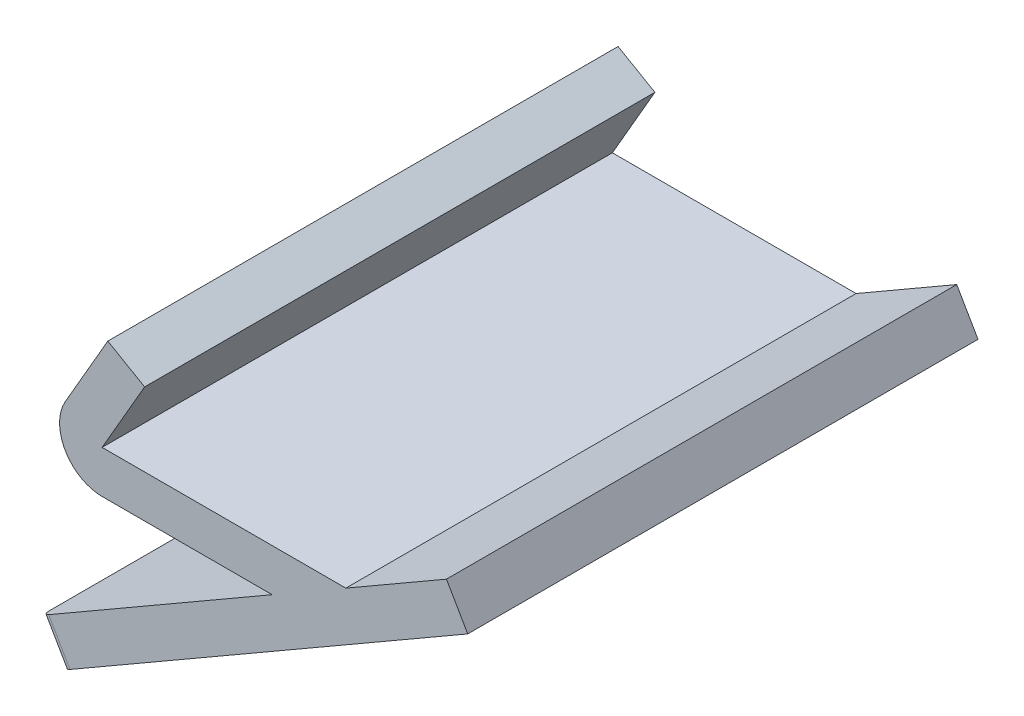
ISO-10303-21;
HEADER;
FILE_DESCRIPTION(('STEP AP214'),'2;1');
FILE_NAME('part.step','',(''),(''),'','','');
FILE_SCHEMA(('AUTOMOTIVE_DESIGN { 1 0 10303 214 1 1 1 1 }'));
ENDSEC;
DATA;
#1=APPLICATION_CONTEXT('core data for automotive mechanical design processes');
#2=APPLICATION_PROTOCOL_DEFINITION('international standard','automotive_design',2000,#1);
#3=PRODUCT_CONTEXT('',#1,'mechanical');
#4=PRODUCT('Part','Part','',(#3));
#5=PRODUCT_RELATED_PRODUCT_CATEGORY('part','',(#4));
#6=PRODUCT_DEFINITION_FORMATION('','',#4);
#7=PRODUCT_DEFINITION_CONTEXT('part definition',#1,'design');
#8=PRODUCT_DEFINITION('design','',#6,#7);
#9=PRODUCT_DEFINITION_SHAPE('','',#8);
#10=(LENGTH_UNIT() NAMED_UNIT(*) SI_UNIT(.MILLI.,.METRE.));
#11=(NAMED_UNIT(*) PLANE_ANGLE_UNIT() SI_UNIT($,.RADIAN.));
#12=(NAMED_UNIT(*) SI_UNIT($,.STERADIAN.) SOLID_ANGLE_UNIT());
#13=UNCERTAINTY_MEASURE_WITH_UNIT(LENGTH_MEASURE(1.E-05),#10,'distance_accuracy_value','');
#14=(GEOMETRIC_REPRESENTATION_CONTEXT(3) GLOBAL_UNCERTAINTY_ASSIGNED_CONTEXT((#13)) GLOBAL_UNIT_ASSIGNED_CONTEXT((#10,
#11,#12)) REPRESENTATION_CONTEXT('',''));
#15=CARTESIAN_POINT('',(0.,0.,0.));
#16=DIRECTION('',(0.,0.,1.));
#17=DIRECTION('',(1.,0.,0.));
#18=AXIS2_PLACEMENT_3D('',#15,#16,#17);
#19=CARTESIAN_POINT('',(0.,0.,60.));
#20=DIRECTION('',(0.,0.,1.));
#21=DIRECTION('',(1.,0.,0.));
#22=AXIS2_PLACEMENT_3D('',#19,#20,#21);
#23=PLANE('',#22);
#24=DIRECTION('',(-0.866025403784442,-0.499999999999995,0.));
#25=VECTOR('',#24,1.);
#26=CARTESIAN_POINT('',(8.25471698113209,10.6272579891649,60.));
#27=LINE('',#26,#25);
#28=CARTESIAN_POINT('',(0.754716981131959,6.29713097024269,60.));
#29=VERTEX_POINT('',#28);
#30=CARTESIAN_POINT('',(-25.5202737664612,-8.87274201083493,60.));
#31=VERTEX_POINT('',#30);
#32=EDGE_CURVE('E245',#29,#31,#27,.T.);
#33=ORIENTED_EDGE('',*,*,#32,.T.);
#34=DIRECTION('',(-0.499999999999995,0.866025403784442,0.));
#35=VECTOR('',#34,1.);
#36=CARTESIAN_POINT('',(4.47972623353853,-60.8342662379014,60.));
#37=LINE('',#36,#35);
#38=CARTESIAN_POINT('',(-23.0202737664612,-13.2028690297572,60.));
#39=VERTEX_POINT('',#38);
#40=EDGE_CURVE('E50',#39,#31,#37,.T.);
#41=ORIENTED_EDGE('',*,*,#40,.F.);
#42=DIRECTION('',(0.866025403784441,0.499999999999995,0.));
#43=VECTOR('',#42,1.);
#44=CARTESIAN_POINT('',(10.7547169811321,6.29713097024269,60.));
#45=LINE('',#44,#43);
#46=CARTESIAN_POINT('',(23.7450980378987,13.7971309702426,60.));
#47=VERTEX_POINT('',#46);
#48=EDGE_CURVE('E238',#39,#47,#45,.T.);
#49=ORIENTED_EDGE('',*,*,#48,.T.);
#50=DIRECTION('',(-0.499999999999995,0.866025403784442,0.));
#51=VECTOR('',#50,1.);
#52=CARTESIAN_POINT('',(23.7450980378987,13.7971309702426,60.));
#53=LINE('',#52,#51);
#54=CARTESIAN_POINT('',(21.2450980378987,18.1272579891648,60.));
#55=VERTEX_POINT('',#54);
#56=EDGE_CURVE('E210',#47,#55,#53,.T.);
#57=ORIENTED_EDGE('',*,*,#56,.T.);
#58=CARTESIAN_POINT('',(9.41497101897644,11.2971309702427,60.));
#59=VERTEX_POINT('',#58);
#60=EDGE_CURVE('E246',#55,#59,#27,.T.);
#61=ORIENTED_EDGE('',*,*,#60,.T.);
#62=DIRECTION('',(-1.,0.,0.));
#63=VECTOR('',#62,1.);
#64=CARTESIAN_POINT('',(-19.2452830188679,11.2971309702427,60.));
#65=LINE('',#64,#63);
#66=CARTESIAN_POINT('',(-19.2452830188679,11.2971309702427,60.));
#67=VERTEX_POINT('',#66);
#68=EDGE_CURVE('E198',#59,#67,#65,.T.);
#69=ORIENTED_EDGE('',*,*,#68,.T.);
#70=DIRECTION('',(0.500000000000004,0.866025403784436,0.));
#71=VECTOR('',#70,1.);
#72=CARTESIAN_POINT('',(-19.2452830188679,11.2971309702427,60.));
#73=LINE('',#72,#71);
#74=CARTESIAN_POINT('',(-14.2452830188678,19.9573850080872,60.));
#75=VERTEX_POINT('',#74);
#76=EDGE_CURVE('E165',#67,#75,#73,.T.);
#77=ORIENTED_EDGE('',*,*,#76,.T.);
#78=DIRECTION('',(-0.866025403784446,0.499999999999988,0.));
#79=VECTOR('',#78,1.);
#80=CARTESIAN_POINT('',(-14.2452830188678,19.9573850080872,60.));
#81=LINE('',#80,#79);
#82=CARTESIAN_POINT('',(-18.5754100377901,22.4573850080871,60.));
#83=VERTEX_POINT('',#82);
#84=EDGE_CURVE('E178',#75,#83,#81,.T.);
#85=ORIENTED_EDGE('',*,*,#84,.T.);
#86=DIRECTION('',(-0.500000000000004,-0.866025403784436,0.));
#87=VECTOR('',#86,1.);
#88=CARTESIAN_POINT('',(-23.5754100377901,13.7971309702428,60.));
#89=LINE('',#88,#87);
#90=CARTESIAN_POINT('',(-23.5754100377901,13.7971309702428,60.));
#91=VERTEX_POINT('',#90);
#92=EDGE_CURVE('E170',#83,#91,#89,.T.);
#93=ORIENTED_EDGE('',*,*,#92,.T.);
#94=CARTESIAN_POINT('',(-19.2452830188679,11.2971309702427,60.));
#95=DIRECTION('',(0.,0.,1.));
#96=DIRECTION('',(-1.,0.,0.));
#97=AXIS2_PLACEMENT_3D('',#94,#95,#96);
#98=CIRCLE('',#97,5.);
#99=CARTESIAN_POINT('',(-19.2452830188679,6.29713097024269,60.));
#100=VERTEX_POINT('',#99);
#101=EDGE_CURVE('E184',#91,#100,#98,.T.);
#102=ORIENTED_EDGE('',*,*,#101,.T.);
#103=DIRECTION('',(1.,0.,0.));
#104=VECTOR('',#103,1.);
#105=CARTESIAN_POINT('',(-19.2452830188679,6.29713097024269,60.));
#106=LINE('',#105,#104);
#107=EDGE_CURVE('E195',#100,#29,#106,.T.);
#108=ORIENTED_EDGE('',*,*,#107,.T.);
#109=EDGE_LOOP('',(#33,#41,#49,#57,#61,#69,#77,#85,#93,#102,#108));
#110=FACE_BOUND('',#109,.T.);
#111=ADVANCED_FACE('F35',(#110),#23,.T.);
#112=CARTESIAN_POINT('',(0.,0.,0.));
#113=DIRECTION('',(0.,0.,1.));
#114=DIRECTION('',(1.,0.,0.));
#115=AXIS2_PLACEMENT_3D('',#112,#113,#114);
#116=PLANE('',#115);
#117=DIRECTION('',(-0.499999999999995,0.866025403784442,0.));
#118=VECTOR('',#117,1.);
#119=CARTESIAN_POINT('',(4.47972623353853,-60.8342662379014,0.));
#120=LINE('',#119,#118);
#121=CARTESIAN_POINT('',(-23.0202737664612,-13.2028690297572,0.));
#122=VERTEX_POINT('',#121);
#123=CARTESIAN_POINT('',(-25.5202737664612,-8.87274201083493,0.));
#124=VERTEX_POINT('',#123);
#125=EDGE_CURVE('E290',#122,#124,#120,.T.);
#126=ORIENTED_EDGE('',*,*,#125,.T.);
#127=DIRECTION('',(-0.866025403784441,-0.499999999999995,0.));
#128=VECTOR('',#127,1.);
#129=CARTESIAN_POINT('',(21.2450980378987,18.1272579891648,0.));
#130=LINE('',#129,#128);
#131=CARTESIAN_POINT('',(0.754716981131963,6.29713097024269,0.));
#132=VERTEX_POINT('',#131);
#133=EDGE_CURVE('E241',#132,#124,#130,.T.);
#134=ORIENTED_EDGE('',*,*,#133,.F.);
#135=DIRECTION('',(1.,0.,0.));
#136=VECTOR('',#135,1.);
#137=CARTESIAN_POINT('',(-19.2452830188679,6.29713097024269,0.));
#138=LINE('',#137,#136);
#139=CARTESIAN_POINT('',(-19.2452830188679,6.29713097024269,0.));
#140=VERTEX_POINT('',#139);
#141=EDGE_CURVE('E194',#140,#132,#138,.T.);
#142=ORIENTED_EDGE('',*,*,#141,.F.);
#143=CARTESIAN_POINT('',(-19.2452830188679,11.2971309702427,0.));
#144=DIRECTION('',(0.,0.,1.));
#145=DIRECTION('',(-1.,0.,0.));
#146=AXIS2_PLACEMENT_3D('',#143,#144,#145);
#147=CIRCLE('',#146,5.);
#148=CARTESIAN_POINT('',(-23.5754100377901,13.7971309702428,0.));
#149=VERTEX_POINT('',#148);
#150=EDGE_CURVE('E186',#149,#140,#147,.T.);
#151=ORIENTED_EDGE('',*,*,#150,.F.);
#152=DIRECTION('',(-0.500000000000004,-0.866025403784436,0.));
#153=VECTOR('',#152,1.);
#154=CARTESIAN_POINT('',(-23.5754100377901,13.7971309702428,0.));
#155=LINE('',#154,#153);
#156=CARTESIAN_POINT('',(-18.5754100377901,22.4573850080871,0.));
#157=VERTEX_POINT('',#156);
#158=EDGE_CURVE('E173',#157,#149,#155,.T.);
#159=ORIENTED_EDGE('',*,*,#158,.F.);
#160=DIRECTION('',(-0.866025403784446,0.499999999999988,0.));
#161=VECTOR('',#160,1.);
#162=CARTESIAN_POINT('',(-14.2452830188678,19.9573850080872,0.));
#163=LINE('',#162,#161);
#164=CARTESIAN_POINT('',(-14.2452830188678,19.9573850080872,0.));
#165=VERTEX_POINT('',#164);
#166=EDGE_CURVE('E169',#165,#157,#163,.T.);
#167=ORIENTED_EDGE('',*,*,#166,.F.);
#168=DIRECTION('',(0.500000000000004,0.866025403784436,0.));
#169=VECTOR('',#168,1.);
#170=CARTESIAN_POINT('',(-19.2452830188679,11.2971309702427,0.));
#171=LINE('',#170,#169);
#172=CARTESIAN_POINT('',(-19.2452830188679,11.2971309702427,0.));
#173=VERTEX_POINT('',#172);
#174=EDGE_CURVE('E166',#173,#165,#171,.T.);
#175=ORIENTED_EDGE('',*,*,#174,.F.);
#176=DIRECTION('',(-1.,0.,0.));
#177=VECTOR('',#176,1.);
#178=CARTESIAN_POINT('',(-19.2452830188679,11.2971309702427,0.));
#179=LINE('',#178,#177);
#180=CARTESIAN_POINT('',(9.41497101897645,11.2971309702427,0.));
#181=VERTEX_POINT('',#180);
#182=EDGE_CURVE('E199',#181,#173,#179,.T.);
#183=ORIENTED_EDGE('',*,*,#182,.F.);
#184=CARTESIAN_POINT('',(21.2450980378987,18.1272579891648,0.));
#185=VERTEX_POINT('',#184);
#186=EDGE_CURVE('E159',#185,#181,#130,.T.);
#187=ORIENTED_EDGE('',*,*,#186,.F.);
#188=DIRECTION('',(-0.499999999999995,0.866025403784442,0.));
#189=VECTOR('',#188,1.);
#190=CARTESIAN_POINT('',(23.7450980378987,13.7971309702426,0.));
#191=LINE('',#190,#189);
#192=CARTESIAN_POINT('',(23.7450980378987,13.7971309702426,0.));
#193=VERTEX_POINT('',#192);
#194=EDGE_CURVE('E237',#193,#185,#191,.T.);
#195=ORIENTED_EDGE('',*,*,#194,.F.);
#196=DIRECTION('',(0.866025403784441,0.499999999999995,0.));
#197=VECTOR('',#196,1.);
#198=CARTESIAN_POINT('',(10.7547169811321,6.29713097024269,0.));
#199=LINE('',#198,#197);
#200=EDGE_CURVE('E235',#122,#193,#199,.T.);
#201=ORIENTED_EDGE('',*,*,#200,.F.);
#202=EDGE_LOOP('',(#126,#134,#142,#151,#159,#167,#175,#183,#187,#195,#201));
#203=FACE_BOUND('',#202,.T.);
#204=ADVANCED_FACE('F265',(#203),#116,.F.);
#205=CARTESIAN_POINT('',(-23.8862991702456,-13.7028690297571,0.));
#206=DIRECTION('',(-0.866025403784438,-0.500000000000002,0.));
#207=DIRECTION('',(0.500000000000002,-0.866025403784438,0.));
#208=AXIS2_PLACEMENT_3D('',#205,#206,#207);
#209=PLANE('',#208);
#210=DIRECTION('',(-0.499999999999995,0.866025403784442,0.));
#211=VECTOR('',#210,1.);
#212=CARTESIAN_POINT('',(3.61370082975409,-61.3342662379014,59.));
#213=LINE('',#212,#211);
#214=CARTESIAN_POINT('',(-23.8862991702456,-13.7028690297571,59.));
#215=VERTEX_POINT('',#214);
#216=CARTESIAN_POINT('',(-26.3862991702456,-9.37274201083492,59.));
#217=VERTEX_POINT('',#216);
#218=EDGE_CURVE('E129',#215,#217,#213,.T.);
#219=ORIENTED_EDGE('',*,*,#218,.T.);
#220=DIRECTION('',(0.,0.,1.));
#221=VECTOR('',#220,1.);
#222=CARTESIAN_POINT('',(-26.3862991702456,-9.37274201083492,0.));
#223=LINE('',#222,#221);
#224=CARTESIAN_POINT('',(-26.3862991702456,-9.37274201083492,1.));
#225=VERTEX_POINT('',#224);
#226=EDGE_CURVE('E139',#225,#217,#223,.T.);
#227=ORIENTED_EDGE('',*,*,#226,.F.);
#228=DIRECTION('',(-0.499999999999995,0.866025403784442,0.));
#229=VECTOR('',#228,1.);
#230=CARTESIAN_POINT('',(3.61370082975429,-61.3342662379013,1.));
#231=LINE('',#230,#229);
#232=CARTESIAN_POINT('',(-23.8862991702456,-13.7028690297571,1.));
#233=VERTEX_POINT('',#232);
#234=EDGE_CURVE('E11',#225,#233,#231,.F.);
#235=ORIENTED_EDGE('',*,*,#234,.T.);
#236=DIRECTION('',(0.,0.,1.));
#237=VECTOR('',#236,1.);
#238=CARTESIAN_POINT('',(-23.8862991702456,-13.7028690297571,0.));
#239=LINE('',#238,#237);
#240=EDGE_CURVE('E141',#233,#215,#239,.T.);
#241=ORIENTED_EDGE('',*,*,#240,.T.);
#242=EDGE_LOOP('',(#219,#227,#235,#241));
#243=FACE_BOUND('',#242,.T.);
#244=ADVANCED_FACE('F138',(#243),#209,.T.);
#245=CARTESIAN_POINT('',(-19.2452830188679,6.29713097024269,60.));
#246=DIRECTION('',(0.,1.,0.));
#247=DIRECTION('',(0.,0.,1.));
#248=AXIS2_PLACEMENT_3D('',#245,#246,#247);
#249=PLANE('',#248);
#250=ORIENTED_EDGE('',*,*,#141,.T.);
#251=DIRECTION('',(0.,0.,1.));
#252=VECTOR('',#251,1.);
#253=CARTESIAN_POINT('',(0.754716981131963,6.29713097024269,60.));
#254=LINE('',#253,#252);
#255=EDGE_CURVE('E162',#132,#29,#254,.T.);
#256=ORIENTED_EDGE('',*,*,#255,.T.);
#257=ORIENTED_EDGE('',*,*,#107,.F.);
#258=DIRECTION('',(0.,0.,-1.));
#259=VECTOR('',#258,1.);
#260=CARTESIAN_POINT('',(-19.2452830188679,6.29713097024269,60.));
#261=LINE('',#260,#259);
#262=EDGE_CURVE('E43',#100,#140,#261,.T.);
#263=ORIENTED_EDGE('',*,*,#262,.T.);
#264=EDGE_LOOP('',(#250,#256,#257,#263));
#265=FACE_BOUND('',#264,.T.);
#266=ADVANCED_FACE('F37',(#265),#249,.F.);
#267=CARTESIAN_POINT('',(-19.2452830188679,11.2971309702427,60.));
#268=DIRECTION('',(0.,-1.,0.));
#269=DIRECTION('',(0.,0.,-1.));
#270=AXIS2_PLACEMENT_3D('',#267,#268,#269);
#271=PLANE('',#270);
#272=ORIENTED_EDGE('',*,*,#68,.F.);
#273=DIRECTION('',(0.,0.,-1.));
#274=VECTOR('',#273,1.);
#275=CARTESIAN_POINT('',(9.41497101897646,11.2971309702427,60.));
#276=LINE('',#275,#274);
#277=EDGE_CURVE('E150',#59,#181,#276,.T.);
#278=ORIENTED_EDGE('',*,*,#277,.T.);
#279=ORIENTED_EDGE('',*,*,#182,.T.);
#280=DIRECTION('',(0.,0.,-1.));
#281=VECTOR('',#280,1.);
#282=CARTESIAN_POINT('',(-19.2452830188679,11.2971309702427,60.));
#283=LINE('',#282,#281);
#284=EDGE_CURVE('E201',#67,#173,#283,.T.);
#285=ORIENTED_EDGE('',*,*,#284,.F.);
#286=EDGE_LOOP('',(#272,#278,#279,#285));
#287=FACE_BOUND('',#286,.T.);
#288=ADVANCED_FACE('F271',(#287),#271,.F.);
#289=CARTESIAN_POINT('',(-19.2452830188679,11.2971309702427,0.));
#290=DIRECTION('',(0.,0.,1.));
#291=DIRECTION('',(1.,0.,0.));
#292=AXIS2_PLACEMENT_3D('',#289,#290,#291);
#293=CYLINDRICAL_SURFACE('',#292,5.);
#294=ORIENTED_EDGE('',*,*,#101,.F.);
#295=DIRECTION('',(0.,0.,1.));
#296=VECTOR('',#295,1.);
#297=CARTESIAN_POINT('',(-23.5754100377901,13.7971309702428,0.));
#298=LINE('',#297,#296);
#299=EDGE_CURVE('E189',#149,#91,#298,.T.);
#300=ORIENTED_EDGE('',*,*,#299,.F.);
#301=ORIENTED_EDGE('',*,*,#150,.T.);
#302=ORIENTED_EDGE('',*,*,#262,.F.);
#303=EDGE_LOOP('',(#294,#300,#301,#302));
#304=FACE_BOUND('',#303,.T.);
#305=ADVANCED_FACE('F286',(#304),#293,.T.);
#306=CARTESIAN_POINT('',(-23.5754100377901,13.7971309702428,0.));
#307=DIRECTION('',(-0.866025403784436,0.500000000000004,0.));
#308=DIRECTION('',(-0.500000000000004,-0.866025403784436,0.));
#309=AXIS2_PLACEMENT_3D('',#306,#307,#308);
#310=PLANE('',#309);
#311=ORIENTED_EDGE('',*,*,#92,.F.);
#312=DIRECTION('',(0.,0.,1.));
#313=VECTOR('',#312,1.);
#314=CARTESIAN_POINT('',(-18.5754100377901,22.4573850080871,0.));
#315=LINE('',#314,#313);
#316=EDGE_CURVE('E182',#157,#83,#315,.T.);
#317=ORIENTED_EDGE('',*,*,#316,.F.);
#318=ORIENTED_EDGE('',*,*,#158,.T.);
#319=ORIENTED_EDGE('',*,*,#299,.T.);
#320=EDGE_LOOP('',(#311,#317,#318,#319));
#321=FACE_BOUND('',#320,.T.);
#322=ADVANCED_FACE('F279',(#321),#310,.T.);
#323=CARTESIAN_POINT('',(-14.2452830188678,19.9573850080872,0.));
#324=DIRECTION('',(0.499999999999988,0.866025403784446,0.));
#325=DIRECTION('',(-0.866025403784446,0.499999999999988,0.));
#326=AXIS2_PLACEMENT_3D('',#323,#324,#325);
#327=PLANE('',#326);
#328=ORIENTED_EDGE('',*,*,#84,.F.);
#329=DIRECTION('',(0.,0.,1.));
#330=VECTOR('',#329,1.);
#331=CARTESIAN_POINT('',(-14.2452830188678,19.9573850080872,0.));
#332=LINE('',#331,#330);
#333=EDGE_CURVE('E175',#165,#75,#332,.T.);
#334=ORIENTED_EDGE('',*,*,#333,.F.);
#335=ORIENTED_EDGE('',*,*,#166,.T.);
#336=ORIENTED_EDGE('',*,*,#316,.T.);
#337=EDGE_LOOP('',(#328,#334,#335,#336));
#338=FACE_BOUND('',#337,.T.);
#339=ADVANCED_FACE('F347',(#338),#327,.T.);
#340=CARTESIAN_POINT('',(-19.2452830188679,11.2971309702427,0.));
#341=DIRECTION('',(0.866025403784436,-0.500000000000004,0.));
#342=DIRECTION('',(0.500000000000004,0.866025403784436,0.));
#343=AXIS2_PLACEMENT_3D('',#340,#341,#342);
#344=PLANE('',#343);
#345=ORIENTED_EDGE('',*,*,#76,.F.);
#346=ORIENTED_EDGE('',*,*,#284,.T.);
#347=ORIENTED_EDGE('',*,*,#174,.T.);
#348=ORIENTED_EDGE('',*,*,#333,.T.);
#349=EDGE_LOOP('',(#345,#346,#347,#348));
#350=FACE_BOUND('',#349,.T.);
#351=ADVANCED_FACE('F274',(#350),#344,.T.);
#352=CARTESIAN_POINT('',(10.7547169811321,6.29713097024269,0.));
#353=DIRECTION('',(0.499999999999995,-0.866025403784441,0.));
#354=DIRECTION('',(0.866025403784441,0.499999999999995,0.));
#355=AXIS2_PLACEMENT_3D('',#352,#353,#354);
#356=PLANE('',#355);
#357=CARTESIAN_POINT('',(-23.0202737664612,-13.2028690297571,59.));
#358=DIRECTION('',(0.499999999999995,-0.866025403784441,0.));
#359=DIRECTION('',(0.866025403784441,0.499999999999995,0.));
#360=AXIS2_PLACEMENT_3D('',#357,#358,#359);
#361=CIRCLE('',#360,1.);
#362=EDGE_CURVE('E293',#215,#39,#361,.F.);
#363=ORIENTED_EDGE('',*,*,#362,.F.);
#364=ORIENTED_EDGE('',*,*,#240,.F.);
#365=CARTESIAN_POINT('',(-23.0202737664612,-13.2028690297571,1.));
#366=DIRECTION('',(0.499999999999995,-0.866025403784441,0.));
#367=DIRECTION('',(0.866025403784441,0.499999999999995,0.));
#368=AXIS2_PLACEMENT_3D('',#365,#366,#367);
#369=CIRCLE('',#368,1.);
#370=EDGE_CURVE('E58',#122,#233,#369,.F.);
#371=ORIENTED_EDGE('',*,*,#370,.F.);
#372=ORIENTED_EDGE('',*,*,#200,.T.);
#373=DIRECTION('',(0.,0.,1.));
#374=VECTOR('',#373,1.);
#375=CARTESIAN_POINT('',(23.7450980378987,13.7971309702426,0.));
#376=LINE('',#375,#374);
#377=EDGE_CURVE('E153',#193,#47,#376,.T.);
#378=ORIENTED_EDGE('',*,*,#377,.T.);
#379=ORIENTED_EDGE('',*,*,#48,.F.);
#380=EDGE_LOOP('',(#363,#364,#371,#372,#378,#379));
#381=FACE_BOUND('',#380,.T.);
#382=CARTESIAN_POINT('',(-18.6579840955324,-10.6842999139633,26.5000985184251));
#383=DIRECTION('',(0.499999999999995,-0.866025403784441,0.));
#384=DIRECTION('',(0.866025403784441,0.499999999999995,0.));
#385=AXIS2_PLACEMENT_3D('',#382,#383,#384);
#386=CIRCLE('',#385,1.7);
#387=CARTESIAN_POINT('',(-20.130227281966,-11.5342999139633,26.5000985184251));
#388=VERTEX_POINT('',#387);
#389=EDGE_CURVE('E212',#388,#388,#386,.T.);
#390=ORIENTED_EDGE('',*,*,#389,.F.);
#391=EDGE_LOOP('',(#390));
#392=FACE_BOUND('',#391,.T.);
#393=CARTESIAN_POINT('',(-18.690146747539,-10.7028690297572,33.5));
#394=DIRECTION('',(0.499999999999995,-0.866025403784441,0.));
#395=DIRECTION('',(0.866025403784441,0.499999999999995,0.));
#396=AXIS2_PLACEMENT_3D('',#393,#394,#395);
#397=CIRCLE('',#396,1.7);
#398=CARTESIAN_POINT('',(-20.1623899339725,-11.5528690297572,33.5));
#399=VERTEX_POINT('',#398);
#400=EDGE_CURVE('E208',#399,#399,#397,.T.);
#401=ORIENTED_EDGE('',*,*,#400,.F.);
#402=EDGE_LOOP('',(#401));
#403=FACE_BOUND('',#402,.T.);
#404=ADVANCED_FACE('F252',(#381,#392,#403),#356,.T.);
#405=CARTESIAN_POINT('',(8.25471698113209,10.6272579891649,0.));
#406=DIRECTION('',(-0.499999999999995,0.866025403784441,0.));
#407=DIRECTION('',(-0.866025403784442,-0.499999999999995,0.));
#408=AXIS2_PLACEMENT_3D('',#405,#406,#407);
#409=PLANE('',#408);
#410=CARTESIAN_POINT('',(-25.5202737664612,-8.87274201083493,59.));
#411=DIRECTION('',(0.499999999999995,-0.866025403784442,0.));
#412=DIRECTION('',(0.866025403784442,0.499999999999995,0.));
#413=AXIS2_PLACEMENT_3D('',#410,#411,#412);
#414=CIRCLE('',#413,1.);
#415=EDGE_CURVE('E126',#31,#217,#414,.T.);
#416=ORIENTED_EDGE('',*,*,#415,.F.);
#417=ORIENTED_EDGE('',*,*,#32,.F.);
#418=ORIENTED_EDGE('',*,*,#255,.F.);
#419=ORIENTED_EDGE('',*,*,#133,.T.);
#420=CARTESIAN_POINT('',(-25.5202737664612,-8.87274201083493,1.));
#421=DIRECTION('',(0.499999999999995,-0.866025403784442,0.));
#422=DIRECTION('',(0.866025403784442,0.499999999999995,0.));
#423=AXIS2_PLACEMENT_3D('',#420,#421,#422);
#424=CIRCLE('',#423,1.);
#425=EDGE_CURVE('E147',#225,#124,#424,.T.);
#426=ORIENTED_EDGE('',*,*,#425,.F.);
#427=ORIENTED_EDGE('',*,*,#226,.T.);
#428=EDGE_LOOP('',(#416,#417,#418,#419,#426,#427));
#429=FACE_BOUND('',#428,.T.);
#430=CARTESIAN_POINT('',(-21.1579840955324,-6.35417289504112,26.5000985184251));
#431=DIRECTION('',(-0.499999999999995,0.866025403784441,0.));
#432=DIRECTION('',(-0.866025403784442,-0.499999999999995,0.));
#433=AXIS2_PLACEMENT_3D('',#430,#431,#432);
#434=CIRCLE('',#433,3.);
#435=CARTESIAN_POINT('',(-23.7560603068857,-7.85417289504111,26.5000985184251));
#436=VERTEX_POINT('',#435);
#437=EDGE_CURVE('E227',#436,#436,#434,.T.);
#438=ORIENTED_EDGE('',*,*,#437,.F.);
#439=EDGE_LOOP('',(#438));
#440=FACE_BOUND('',#439,.T.);
#441=CARTESIAN_POINT('',(-21.190146747539,-6.37274201083495,33.5));
#442=DIRECTION('',(-0.499999999999995,0.866025403784441,0.));
#443=DIRECTION('',(-0.866025403784442,-0.499999999999995,0.));
#444=AXIS2_PLACEMENT_3D('',#441,#442,#443);
#445=CIRCLE('',#444,3.);
#446=CARTESIAN_POINT('',(-23.7882229588923,-7.87274201083493,33.5));
#447=VERTEX_POINT('',#446);
#448=EDGE_CURVE('E214',#447,#447,#445,.T.);
#449=ORIENTED_EDGE('',*,*,#448,.F.);
#450=EDGE_LOOP('',(#449));
#451=FACE_BOUND('',#450,.T.);
#452=ADVANCED_FACE('F144',(#429,#440,#451),#409,.T.);
#453=ORIENTED_EDGE('',*,*,#277,.F.);
#454=ORIENTED_EDGE('',*,*,#60,.F.);
#455=DIRECTION('',(0.,0.,1.));
#456=VECTOR('',#455,1.);
#457=CARTESIAN_POINT('',(21.2450980378987,18.1272579891648,0.));
#458=LINE('',#457,#456);
#459=EDGE_CURVE('E148',#185,#55,#458,.T.);
#460=ORIENTED_EDGE('',*,*,#459,.F.);
#461=ORIENTED_EDGE('',*,*,#186,.T.);
#462=EDGE_LOOP('',(#453,#454,#460,#461));
#463=FACE_BOUND('',#462,.T.);
#464=ADVANCED_FACE('F261',(#463),#409,.T.);
#465=CARTESIAN_POINT('',(23.7450980378987,13.7971309702426,0.));
#466=DIRECTION('',(0.866025403784442,0.499999999999994,0.));
#467=DIRECTION('',(-0.499999999999995,0.866025403784442,0.));
#468=AXIS2_PLACEMENT_3D('',#465,#466,#467);
#469=PLANE('',#468);
#470=ORIENTED_EDGE('',*,*,#56,.F.);
#471=ORIENTED_EDGE('',*,*,#377,.F.);
#472=ORIENTED_EDGE('',*,*,#194,.T.);
#473=ORIENTED_EDGE('',*,*,#459,.T.);
#474=EDGE_LOOP('',(#470,#471,#472,#473));
#475=FACE_BOUND('',#474,.T.);
#476=ADVANCED_FACE('F257',(#475),#469,.T.);
#477=CARTESIAN_POINT('',(-21.190146747539,-6.37274201083495,33.5));
#478=DIRECTION('',(-0.499999999999995,0.866025403784441,0.));
#479=DIRECTION('',(-0.866025403784442,-0.499999999999995,0.));
#480=AXIS2_PLACEMENT_3D('',#477,#478,#479);
#481=CYLINDRICAL_SURFACE('',#480,1.7);
#482=CARTESIAN_POINT('',(-19.490146747539,-9.31722838370205,33.5));
#483=DIRECTION('',(-0.499999999999995,0.866025403784441,0.));
#484=DIRECTION('',(-0.866025403784442,-0.499999999999995,0.));
#485=AXIS2_PLACEMENT_3D('',#482,#483,#484);
#486=CIRCLE('',#485,1.7);
#487=CARTESIAN_POINT('',(-20.9623899339725,-10.167228383702,33.5));
#488=VERTEX_POINT('',#487);
#489=EDGE_CURVE('E211',#488,#488,#486,.T.);
#490=CARTESIAN_POINT('',(-20.1623899339725,-11.5528690297572,33.5));
#491=CARTESIAN_POINT('',(-20.1707232673059,-11.5384352730274,33.5));
#492=CARTESIAN_POINT('',(-20.1790566006392,-11.5240015162977,33.5));
#493=CARTESIAN_POINT('',(-20.1957232673059,-11.4951340028382,33.5));
#494=CARTESIAN_POINT('',(-20.2040566006392,-11.4807002461085,33.5));
#495=CARTESIAN_POINT('',(-20.2207232673059,-11.451832732649,33.5));
#496=CARTESIAN_POINT('',(-20.2290566006392,-11.4373989759192,33.5));
#497=CARTESIAN_POINT('',(-20.2457232673059,-11.4085314624597,33.5));
#498=CARTESIAN_POINT('',(-20.2540566006392,-11.39409770573,33.5));
#499=CARTESIAN_POINT('',(-20.2707232673059,-11.3652301922705,33.5));
#500=CARTESIAN_POINT('',(-20.2790566006392,-11.3507964355408,33.5));
#501=CARTESIAN_POINT('',(-20.2957232673059,-11.3219289220813,33.5));
#502=CARTESIAN_POINT('',(-20.3040566006392,-11.3074951653516,33.5));
#503=CARTESIAN_POINT('',(-20.3207232673059,-11.2786276518921,33.5));
#504=CARTESIAN_POINT('',(-20.3290566006392,-11.2641938951623,33.5));
#505=CARTESIAN_POINT('',(-20.3457232673059,-11.2353263817029,33.5));
#506=CARTESIAN_POINT('',(-20.3540566006392,-11.2208926249731,33.5));
#507=CARTESIAN_POINT('',(-20.3707232673059,-11.1920251115136,33.5));
#508=CARTESIAN_POINT('',(-20.3790566006392,-11.1775913547839,33.5));
#509=CARTESIAN_POINT('',(-20.3957232673059,-11.1487238413244,33.5));
#510=CARTESIAN_POINT('',(-20.4040566006392,-11.1342900845947,33.5));
#511=CARTESIAN_POINT('',(-20.4207232673059,-11.1054225711352,33.5));
#512=CARTESIAN_POINT('',(-20.4290566006392,-11.0909888144055,33.5));
#513=CARTESIAN_POINT('',(-20.4457232673059,-11.062121300946,33.5));
#514=CARTESIAN_POINT('',(-20.4540566006392,-11.0476875442162,33.5));
#515=CARTESIAN_POINT('',(-20.4707232673059,-11.0188200307567,33.5));
#516=CARTESIAN_POINT('',(-20.4790566006392,-11.004386274027,33.5));
#517=CARTESIAN_POINT('',(-20.4957232673059,-10.9755187605675,33.5));
#518=CARTESIAN_POINT('',(-20.5040566006392,-10.9610850038378,33.5));
#519=CARTESIAN_POINT('',(-20.5207232673059,-10.9322174903783,33.5));
#520=CARTESIAN_POINT('',(-20.5290566006392,-10.9177837336486,33.5));
#521=CARTESIAN_POINT('',(-20.5457232673059,-10.8889162201891,33.5));
#522=CARTESIAN_POINT('',(-20.5540566006392,-10.8744824634593,33.5));
#523=CARTESIAN_POINT('',(-20.5707232673059,-10.8456149499999,33.5));
#524=CARTESIAN_POINT('',(-20.5790566006392,-10.8311811932701,33.5));
#525=CARTESIAN_POINT('',(-20.5957232673059,-10.8023136798106,33.5));
#526=CARTESIAN_POINT('',(-20.6040566006392,-10.7878799230809,33.5));
#527=CARTESIAN_POINT('',(-20.6207232673059,-10.7590124096214,33.5));
#528=CARTESIAN_POINT('',(-20.6290566006392,-10.7445786528917,33.5));
#529=CARTESIAN_POINT('',(-20.6457232673059,-10.7157111394322,33.5));
#530=CARTESIAN_POINT('',(-20.6540566006392,-10.7012773827025,33.5));
#531=CARTESIAN_POINT('',(-20.6707232673059,-10.672409869243,33.5));
#532=CARTESIAN_POINT('',(-20.6790566006392,-10.6579761125132,33.5));
#533=CARTESIAN_POINT('',(-20.6957232673059,-10.6291085990537,33.5));
#534=CARTESIAN_POINT('',(-20.7040566006392,-10.614674842324,33.5));
#535=CARTESIAN_POINT('',(-20.7207232673059,-10.5858073288645,33.5));
#536=CARTESIAN_POINT('',(-20.7290566006392,-10.5713735721348,33.5));
#537=CARTESIAN_POINT('',(-20.7457232673059,-10.5425060586753,33.5));
#538=CARTESIAN_POINT('',(-20.7540566006392,-10.5280723019456,33.5));
#539=CARTESIAN_POINT('',(-20.7707232673059,-10.4992047884861,33.5));
#540=CARTESIAN_POINT('',(-20.7790566006392,-10.4847710317563,33.5));
#541=CARTESIAN_POINT('',(-20.7957232673059,-10.4559035182969,33.5));
#542=CARTESIAN_POINT('',(-20.8040566006392,-10.4414697615671,33.5));
#543=CARTESIAN_POINT('',(-20.8207232673059,-10.4126022481076,33.5));
#544=CARTESIAN_POINT('',(-20.8290566006392,-10.3981684913779,33.5));
#545=CARTESIAN_POINT('',(-20.8457232673059,-10.3693009779184,33.5));
#546=CARTESIAN_POINT('',(-20.8540566006392,-10.3548672211887,33.5));
#547=CARTESIAN_POINT('',(-20.8707232673059,-10.3259997077292,33.5));
#548=CARTESIAN_POINT('',(-20.8790566006392,-10.3115659509994,33.5));
#549=CARTESIAN_POINT('',(-20.8957232673059,-10.28269843754,33.5));
#550=CARTESIAN_POINT('',(-20.9040566006392,-10.2682646808102,33.5));
#551=CARTESIAN_POINT('',(-20.9207232673059,-10.2393971673507,33.5));
#552=CARTESIAN_POINT('',(-20.9290566006392,-10.224963410621,33.5));
#553=CARTESIAN_POINT('',(-20.9457232673059,-10.1960958971615,33.5));
#554=CARTESIAN_POINT('',(-20.9540566006392,-10.1816621404318,33.5));
#555=CARTESIAN_POINT('',(-20.9623899339725,-10.167228383702,33.5));
#556=B_SPLINE_CURVE_WITH_KNOTS('',3,(#490,#491,#492,#493,#494,#495,#496,#497,#498,#499,#500,
#501,#502,#503,#504,#505,#506,#507,#508,#509,#510,#511,#512,#513,#514,#515,#516,#517,#518,#519,
#520,#521,#522,#523,#524,#525,#526,#527,#528,#529,#530,#531,#532,#533,#534,#535,#536,#537,#538,
#539,#540,#541,#542,#543,#544,#545,#546,#547,#548,#549,#550,#551,#552,#553,#554,#555),
.UNSPECIFIED.,.F.,.F.,(4,2,2,2,2,2,2,2,2,2,2,2,2,2,2,2,2,2,2,2,2,2,2,2,2,2,2,2,2,2,2,2,4),(0.,
0.0500000000000008,0.100000000000002,0.150000000000001,0.2,0.250000000000002,0.300000000000002,
0.350000000000004,0.400000000000002,0.450000000000004,0.500000000000003,0.550000000000006,
0.600000000000005,0.650000000000004,0.700000000000005,0.750000000000006,0.800000000000005,
0.850000000000006,0.900000000000007,0.950000000000008,1.00000000000001,1.05000000000001,
1.10000000000001,1.15000000000001,1.20000000000001,1.25000000000001,1.30000000000001,
1.35000000000001,1.40000000000001,1.45000000000001,1.50000000000001,1.55000000000001,
1.60000000000001),.UNSPECIFIED.);
#557=EDGE_CURVE('BSEAM317',#399,#488,#556,.T.);
#558=ORIENTED_EDGE('',*,*,#400,.T.);
#559=ORIENTED_EDGE('',*,*,#489,.T.);
#560=ORIENTED_EDGE('',*,*,#557,.T.);
#561=ORIENTED_EDGE('',*,*,#557,.F.);
#562=EDGE_LOOP('',(#558,#560,#559,#561));
#563=FACE_BOUND('',#562,.T.);
#564=ADVANCED_FACE('F317',(#563),#481,.F.);
#565=CARTESIAN_POINT('',(-19.490146747539,-9.31722838370205,35.2));
#566=DIRECTION('',(0.499999999999995,-0.866025403784441,0.));
#567=DIRECTION('',(0.866025403784442,0.499999999999995,0.));
#568=AXIS2_PLACEMENT_3D('',#565,#566,#567);
#569=PLANE('',#568);
#570=ORIENTED_EDGE('',*,*,#489,.F.);
#571=EDGE_LOOP('',(#570));
#572=FACE_BOUND('',#571,.T.);
#573=CARTESIAN_POINT('',(-19.490146747539,-9.31722838370205,33.5));
#574=DIRECTION('',(-0.499999999999995,0.866025403784441,0.));
#575=DIRECTION('',(-0.866025403784442,-0.499999999999995,0.));
#576=AXIS2_PLACEMENT_3D('',#573,#574,#575);
#577=CIRCLE('',#576,3.);
#578=CARTESIAN_POINT('',(-22.0882229588923,-10.817228383702,33.5));
#579=VERTEX_POINT('',#578);
#580=EDGE_CURVE('E219',#579,#579,#577,.T.);
#581=ORIENTED_EDGE('',*,*,#580,.T.);
#582=EDGE_LOOP('',(#581));
#583=FACE_BOUND('',#582,.T.);
#584=ADVANCED_FACE('F308',(#572,#583),#569,.F.);
#585=CARTESIAN_POINT('',(-21.190146747539,-6.37274201083495,33.5));
#586=DIRECTION('',(-0.499999999999995,0.866025403784441,0.));
#587=DIRECTION('',(-0.866025403784442,-0.499999999999995,0.));
#588=AXIS2_PLACEMENT_3D('',#585,#586,#587);
#589=CYLINDRICAL_SURFACE('',#588,3.);
#590=CARTESIAN_POINT('',(-22.0882229588923,-10.817228383702,33.5));
#591=CARTESIAN_POINT('',(-22.1059312922256,-10.7865566506513,33.5));
#592=CARTESIAN_POINT('',(-22.123639625559,-10.7558849176006,33.5));
#593=CARTESIAN_POINT('',(-22.1590562922256,-10.6945414514992,33.5));
#594=CARTESIAN_POINT('',(-22.176764625559,-10.6638697184485,33.5));
#595=CARTESIAN_POINT('',(-22.2121812922256,-10.6025262523471,33.5));
#596=CARTESIAN_POINT('',(-22.229889625559,-10.5718545192964,33.5));
#597=CARTESIAN_POINT('',(-22.2653062922256,-10.510511053195,33.5));
#598=CARTESIAN_POINT('',(-22.283014625559,-10.4798393201443,33.5));
#599=CARTESIAN_POINT('',(-22.3184312922256,-10.4184958540429,33.5));
#600=CARTESIAN_POINT('',(-22.336139625559,-10.3878241209922,33.5));
#601=CARTESIAN_POINT('',(-22.3715562922256,-10.3264806548909,33.5));
#602=CARTESIAN_POINT('',(-22.389264625559,-10.2958089218402,33.5));
#603=CARTESIAN_POINT('',(-22.4246812922256,-10.2344654557388,33.5));
#604=CARTESIAN_POINT('',(-22.442389625559,-10.2037937226881,33.5));
#605=CARTESIAN_POINT('',(-22.4778062922256,-10.1424502565867,33.5));
#606=CARTESIAN_POINT('',(-22.495514625559,-10.111778523536,33.5));
#607=CARTESIAN_POINT('',(-22.5309312922256,-10.0504350574346,33.5));
#608=CARTESIAN_POINT('',(-22.548639625559,-10.0197633243839,33.5));
#609=CARTESIAN_POINT('',(-22.5840562922256,-9.95841985828246,33.5));
#610=CARTESIAN_POINT('',(-22.601764625559,-9.92774812523176,33.5));
#611=CARTESIAN_POINT('',(-22.6371812922256,-9.86640465913037,33.5));
#612=CARTESIAN_POINT('',(-22.654889625559,-9.83573292607967,33.5));
#613=CARTESIAN_POINT('',(-22.6903062922256,-9.77438945997827,33.5));
#614=CARTESIAN_POINT('',(-22.708014625559,-9.74371772692757,33.5));
#615=CARTESIAN_POINT('',(-22.7434312922256,-9.68237426082617,33.5));
#616=CARTESIAN_POINT('',(-22.761139625559,-9.65170252777547,33.5));
#617=CARTESIAN_POINT('',(-22.7965562922256,-9.59035906167408,33.5));
#618=CARTESIAN_POINT('',(-22.814264625559,-9.55968732862338,33.5));
#619=CARTESIAN_POINT('',(-22.8496812922256,-9.49834386252198,33.5));
#620=CARTESIAN_POINT('',(-22.867389625559,-9.46767212947128,33.5));
#621=CARTESIAN_POINT('',(-22.9028062922256,-9.40632866336988,33.5));
#622=CARTESIAN_POINT('',(-22.920514625559,-9.37565693031918,33.5));
#623=CARTESIAN_POINT('',(-22.9559312922256,-9.31431346421778,33.5));
#624=CARTESIAN_POINT('',(-22.973639625559,-9.28364173116709,33.5));
#625=CARTESIAN_POINT('',(-23.0090562922256,-9.22229826506569,33.5));
#626=CARTESIAN_POINT('',(-23.026764625559,-9.19162653201499,33.5));
#627=CARTESIAN_POINT('',(-23.0621812922256,-9.13028306591359,33.5));
#628=CARTESIAN_POINT('',(-23.079889625559,-9.09961133286289,33.5));
#629=CARTESIAN_POINT('',(-23.1153062922256,-9.03826786676149,33.5));
#630=CARTESIAN_POINT('',(-23.133014625559,-9.00759613371079,33.5));
#631=CARTESIAN_POINT('',(-23.1684312922256,-8.9462526676094,33.5));
#632=CARTESIAN_POINT('',(-23.186139625559,-8.9155809345587,33.5));
#633=CARTESIAN_POINT('',(-23.2215562922256,-8.8542374684573,33.5));
#634=CARTESIAN_POINT('',(-23.239264625559,-8.8235657354066,33.5));
#635=CARTESIAN_POINT('',(-23.2746812922256,-8.7622222693052,33.5));
#636=CARTESIAN_POINT('',(-23.292389625559,-8.73155053625451,33.5));
#637=CARTESIAN_POINT('',(-23.3278062922256,-8.67020707015311,33.5));
#638=CARTESIAN_POINT('',(-23.345514625559,-8.63953533710241,33.5));
#639=CARTESIAN_POINT('',(-23.3809312922256,-8.57819187100101,33.5));
#640=CARTESIAN_POINT('',(-23.398639625559,-8.54752013795031,33.5));
#641=CARTESIAN_POINT('',(-23.4340562922256,-8.48617667184891,33.5));
#642=CARTESIAN_POINT('',(-23.451764625559,-8.45550493879821,33.5));
#643=CARTESIAN_POINT('',(-23.4871812922256,-8.39416147269682,33.5));
#644=CARTESIAN_POINT('',(-23.504889625559,-8.36348973964612,33.5));
#645=CARTESIAN_POINT('',(-23.5403062922256,-8.30214627354472,33.5));
#646=CARTESIAN_POINT('',(-23.558014625559,-8.27147454049402,33.5));
#647=CARTESIAN_POINT('',(-23.5934312922256,-8.21013107439262,33.5));
#648=CARTESIAN_POINT('',(-23.611139625559,-8.17945934134192,33.5));
#649=CARTESIAN_POINT('',(-23.6465562922256,-8.11811587524052,33.5));
#650=CARTESIAN_POINT('',(-23.6642646255589,-8.08744414218983,33.5));
#651=CARTESIAN_POINT('',(-23.6996812922256,-8.02610067608843,33.5));
#652=CARTESIAN_POINT('',(-23.717389625559,-7.99542894303773,33.5));
#653=CARTESIAN_POINT('',(-23.7528062922256,-7.93408547693633,33.5));
#654=CARTESIAN_POINT('',(-23.7705146255589,-7.90341374388563,33.5));
#655=CARTESIAN_POINT('',(-23.7882229588923,-7.87274201083493,33.5));
#656=B_SPLINE_CURVE_WITH_KNOTS('',3,(#590,#591,#592,#593,#594,#595,#596,#597,#598,#599,#600,
#601,#602,#603,#604,#605,#606,#607,#608,#609,#610,#611,#612,#613,#614,#615,#616,#617,#618,#619,
#620,#621,#622,#623,#624,#625,#626,#627,#628,#629,#630,#631,#632,#633,#634,#635,#636,#637,#638,
#639,#640,#641,#642,#643,#644,#645,#646,#647,#648,#649,#650,#651,#652,#653,#654,#655),
.UNSPECIFIED.,.F.,.F.,(4,2,2,2,2,2,2,2,2,2,2,2,2,2,2,2,2,2,2,2,2,2,2,2,2,2,2,2,2,2,2,2,4),(0.,
0.106249999999999,0.212500000000001,0.318749999999998,0.425000000000001,0.531249999999999,
0.6375,0.743750000000001,0.85,0.956250000000002,1.0625,1.16875,1.275,1.38125,1.4875,1.59375,1.7,
1.80625,1.9125,2.01875,2.125,2.23125,2.3375,2.44375,2.55,2.65625,2.7625,2.86875,2.975,3.08125,
3.1875,3.29375,3.4),.UNSPECIFIED.);
#657=EDGE_CURVE('BSEAM305',#579,#447,#656,.T.);
#658=ORIENTED_EDGE('',*,*,#580,.F.);
#659=ORIENTED_EDGE('',*,*,#448,.T.);
#660=ORIENTED_EDGE('',*,*,#657,.T.);
#661=ORIENTED_EDGE('',*,*,#657,.F.);
#662=EDGE_LOOP('',(#658,#660,#659,#661));
#663=FACE_BOUND('',#662,.T.);
#664=ADVANCED_FACE('F305',(#663),#589,.F.);
#665=CARTESIAN_POINT('',(-21.1579840955324,-6.35417289504112,26.5000985184251));
#666=DIRECTION('',(-0.499999999999995,0.866025403784441,0.));
#667=DIRECTION('',(-0.866025403784442,-0.499999999999995,0.));
#668=AXIS2_PLACEMENT_3D('',#665,#666,#667);
#669=CYLINDRICAL_SURFACE('',#668,1.7);
#670=CARTESIAN_POINT('',(-19.4579840955324,-9.29865926790822,26.5000985184251));
#671=DIRECTION('',(-0.499999999999995,0.866025403784441,0.));
#672=DIRECTION('',(-0.866025403784442,-0.499999999999995,0.));
#673=AXIS2_PLACEMENT_3D('',#670,#671,#672);
#674=CIRCLE('',#673,1.7);
#675=CARTESIAN_POINT('',(-20.930227281966,-10.1486592679082,26.5000985184251));
#676=VERTEX_POINT('',#675);
#677=EDGE_CURVE('E215',#676,#676,#674,.T.);
#678=CARTESIAN_POINT('',(-20.130227281966,-11.5342999139633,26.5000985184251));
#679=CARTESIAN_POINT('',(-20.1385606152993,-11.5198661572336,26.5000985184251));
#680=CARTESIAN_POINT('',(-20.1468939486326,-11.5054324005038,26.5000985184251));
#681=CARTESIAN_POINT('',(-20.1635606152993,-11.4765648870444,26.5000985184251));
#682=CARTESIAN_POINT('',(-20.1718939486326,-11.4621311303146,26.5000985184251));
#683=CARTESIAN_POINT('',(-20.1885606152993,-11.4332636168551,26.5000985184251));
#684=CARTESIAN_POINT('',(-20.1968939486326,-11.4188298601254,26.5000985184251));
#685=CARTESIAN_POINT('',(-20.2135606152993,-11.3899623466659,26.5000985184251));
#686=CARTESIAN_POINT('',(-20.2218939486326,-11.3755285899362,26.5000985184251));
#687=CARTESIAN_POINT('',(-20.2385606152993,-11.3466610764767,26.5000985184251));
#688=CARTESIAN_POINT('',(-20.2468939486326,-11.332227319747,26.5000985184251));
#689=CARTESIAN_POINT('',(-20.2635606152993,-11.3033598062875,26.5000985184251));
#690=CARTESIAN_POINT('',(-20.2718939486326,-11.2889260495577,26.5000985184251));
#691=CARTESIAN_POINT('',(-20.2885606152993,-11.2600585360982,26.5000985184251));
#692=CARTESIAN_POINT('',(-20.2968939486326,-11.2456247793685,26.5000985184251));
#693=CARTESIAN_POINT('',(-20.3135606152993,-11.216757265909,26.5000985184251));
#694=CARTESIAN_POINT('',(-20.3218939486326,-11.2023235091793,26.5000985184251));
#695=CARTESIAN_POINT('',(-20.3385606152993,-11.1734559957198,26.5000985184251));
#696=CARTESIAN_POINT('',(-20.3468939486326,-11.1590222389901,26.5000985184251));
#697=CARTESIAN_POINT('',(-20.3635606152993,-11.1301547255306,26.5000985184251));
#698=CARTESIAN_POINT('',(-20.3718939486326,-11.1157209688008,26.5000985184251));
#699=CARTESIAN_POINT('',(-20.3885606152993,-11.0868534553414,26.5000985184251));
#700=CARTESIAN_POINT('',(-20.3968939486326,-11.0724196986116,26.5000985184251));
#701=CARTESIAN_POINT('',(-20.4135606152993,-11.0435521851521,26.5000985184251));
#702=CARTESIAN_POINT('',(-20.4218939486326,-11.0291184284224,26.5000985184251));
#703=CARTESIAN_POINT('',(-20.4385606152993,-11.0002509149629,26.5000985184251));
#704=CARTESIAN_POINT('',(-20.4468939486326,-10.9858171582332,26.5000985184251));
#705=CARTESIAN_POINT('',(-20.4635606152993,-10.9569496447737,26.5000985184251));
#706=CARTESIAN_POINT('',(-20.4718939486326,-10.942515888044,26.5000985184251));
#707=CARTESIAN_POINT('',(-20.4885606152993,-10.9136483745845,26.5000985184251));
#708=CARTESIAN_POINT('',(-20.4968939486326,-10.8992146178547,26.5000985184251));
#709=CARTESIAN_POINT('',(-20.5135606152993,-10.8703471043953,26.5000985184251));
#710=CARTESIAN_POINT('',(-20.5218939486326,-10.8559133476655,26.5000985184251));
#711=CARTESIAN_POINT('',(-20.5385606152993,-10.827045834206,26.5000985184251));
#712=CARTESIAN_POINT('',(-20.5468939486326,-10.8126120774763,26.5000985184251));
#713=CARTESIAN_POINT('',(-20.5635606152993,-10.7837445640168,26.5000985184251));
#714=CARTESIAN_POINT('',(-20.5718939486326,-10.7693108072871,26.5000985184251));
#715=CARTESIAN_POINT('',(-20.5885606152993,-10.7404432938276,26.5000985184251));
#716=CARTESIAN_POINT('',(-20.5968939486326,-10.7260095370978,26.5000985184251));
#717=CARTESIAN_POINT('',(-20.6135606152993,-10.6971420236384,26.5000985184251));
#718=CARTESIAN_POINT('',(-20.6218939486326,-10.6827082669086,26.5000985184251));
#719=CARTESIAN_POINT('',(-20.6385606152993,-10.6538407534491,26.5000985184251));
#720=CARTESIAN_POINT('',(-20.6468939486326,-10.6394069967194,26.5000985184251));
#721=CARTESIAN_POINT('',(-20.6635606152993,-10.6105394832599,26.5000985184251));
#722=CARTESIAN_POINT('',(-20.6718939486326,-10.5961057265302,26.5000985184251));
#723=CARTESIAN_POINT('',(-20.6885606152993,-10.5672382130707,26.5000985184251));
#724=CARTESIAN_POINT('',(-20.6968939486326,-10.552804456341,26.5000985184251));
#725=CARTESIAN_POINT('',(-20.7135606152993,-10.5239369428815,26.5000985184251));
#726=CARTESIAN_POINT('',(-20.7218939486326,-10.5095031861517,26.5000985184251));
#727=CARTESIAN_POINT('',(-20.7385606152993,-10.4806356726922,26.5000985184251));
#728=CARTESIAN_POINT('',(-20.7468939486326,-10.4662019159625,26.5000985184251));
#729=CARTESIAN_POINT('',(-20.7635606152993,-10.437334402503,26.5000985184251));
#730=CARTESIAN_POINT('',(-20.7718939486326,-10.4229006457733,26.5000985184251));
#731=CARTESIAN_POINT('',(-20.7885606152993,-10.3940331323138,26.5000985184251));
#732=CARTESIAN_POINT('',(-20.7968939486326,-10.3795993755841,26.5000985184251));
#733=CARTESIAN_POINT('',(-20.8135606152993,-10.3507318621246,26.5000985184251));
#734=CARTESIAN_POINT('',(-20.8218939486326,-10.3362981053948,26.5000985184251));
#735=CARTESIAN_POINT('',(-20.8385606152993,-10.3074305919354,26.5000985184251));
#736=CARTESIAN_POINT('',(-20.8468939486326,-10.2929968352056,26.5000985184251));
#737=CARTESIAN_POINT('',(-20.8635606152993,-10.2641293217461,26.5000985184251));
#738=CARTESIAN_POINT('',(-20.8718939486326,-10.2496955650164,26.5000985184251));
#739=CARTESIAN_POINT('',(-20.8885606152993,-10.2208280515569,26.5000985184251));
#740=CARTESIAN_POINT('',(-20.8968939486326,-10.2063942948272,26.5000985184251));
#741=CARTESIAN_POINT('',(-20.9135606152993,-10.1775267813677,26.5000985184251));
#742=CARTESIAN_POINT('',(-20.9218939486326,-10.163093024638,26.5000985184251));
#743=CARTESIAN_POINT('',(-20.930227281966,-10.1486592679082,26.5000985184251));
#744=B_SPLINE_CURVE_WITH_KNOTS('',3,(#678,#679,#680,#681,#682,#683,#684,#685,#686,#687,#688,
#689,#690,#691,#692,#693,#694,#695,#696,#697,#698,#699,#700,#701,#702,#703,#704,#705,#706,#707,
#708,#709,#710,#711,#712,#713,#714,#715,#716,#717,#718,#719,#720,#721,#722,#723,#724,#725,#726,
#727,#728,#729,#730,#731,#732,#733,#734,#735,#736,#737,#738,#739,#740,#741,#742,#743),
.UNSPECIFIED.,.F.,.F.,(4,2,2,2,2,2,2,2,2,2,2,2,2,2,2,2,2,2,2,2,2,2,2,2,2,2,2,2,2,2,2,2,4),(0.,
0.0499999999999993,0.0999999999999985,0.149999999999999,0.199999999999999,0.250000000000001,0.3,
0.350000000000001,0.4,0.450000000000003,0.5,0.550000000000001,0.600000000000002,
0.650000000000003,0.700000000000004,0.750000000000001,0.800000000000004,0.850000000000003,
0.900000000000002,0.950000000000003,1.,1.05,1.10000000000001,1.15,1.2,1.25,1.3,1.35,
1.40000000000001,1.45000000000001,1.50000000000001,1.55000000000001,1.60000000000001),.UNSPECIFIED.);
#745=EDGE_CURVE('BSEAM307',#388,#676,#744,.T.);
#746=ORIENTED_EDGE('',*,*,#389,.T.);
#747=ORIENTED_EDGE('',*,*,#677,.T.);
#748=ORIENTED_EDGE('',*,*,#745,.T.);
#749=ORIENTED_EDGE('',*,*,#745,.F.);
#750=EDGE_LOOP('',(#746,#748,#747,#749));
#751=FACE_BOUND('',#750,.T.);
#752=ADVANCED_FACE('F307',(#751),#669,.F.);
#753=CARTESIAN_POINT('',(-19.4579840955324,-9.29865926790822,28.2000985184251));
#754=DIRECTION('',(0.499999999999995,-0.866025403784441,0.));
#755=DIRECTION('',(0.866025403784442,0.499999999999995,0.));
#756=AXIS2_PLACEMENT_3D('',#753,#754,#755);
#757=PLANE('',#756);
#758=ORIENTED_EDGE('',*,*,#677,.F.);
#759=EDGE_LOOP('',(#758));
#760=FACE_BOUND('',#759,.T.);
#761=CARTESIAN_POINT('',(-19.4579840955324,-9.29865926790822,26.5000985184251));
#762=DIRECTION('',(-0.499999999999995,0.866025403784441,0.));
#763=DIRECTION('',(-0.866025403784442,-0.499999999999995,0.));
#764=AXIS2_PLACEMENT_3D('',#761,#762,#763);
#765=CIRCLE('',#764,3.);
#766=CARTESIAN_POINT('',(-22.0560603068857,-10.7986592679082,26.5000985184251));
#767=VERTEX_POINT('',#766);
#768=EDGE_CURVE('E222',#767,#767,#765,.T.);
#769=ORIENTED_EDGE('',*,*,#768,.T.);
#770=EDGE_LOOP('',(#769));
#771=FACE_BOUND('',#770,.T.);
#772=ADVANCED_FACE('F315',(#760,#771),#757,.F.);
#773=CARTESIAN_POINT('',(-21.1579840955324,-6.35417289504112,26.5000985184251));
#774=DIRECTION('',(-0.499999999999995,0.866025403784441,0.));
#775=DIRECTION('',(-0.866025403784442,-0.499999999999995,0.));
#776=AXIS2_PLACEMENT_3D('',#773,#774,#775);
#777=CYLINDRICAL_SURFACE('',#776,3.);
#778=CARTESIAN_POINT('',(-22.0560603068857,-10.7986592679082,26.5000985184251));
#779=CARTESIAN_POINT('',(-22.0737686402191,-10.7679875348575,26.5000985184251));
#780=CARTESIAN_POINT('',(-22.0914769735524,-10.7373158018068,26.5000985184251));
#781=CARTESIAN_POINT('',(-22.1268936402191,-10.6759723357054,26.5000985184251));
#782=CARTESIAN_POINT('',(-22.1446019735524,-10.6453006026547,26.5000985184251));
#783=CARTESIAN_POINT('',(-22.1800186402191,-10.5839571365533,26.5000985184251));
#784=CARTESIAN_POINT('',(-22.1977269735524,-10.5532854035026,26.5000985184251));
#785=CARTESIAN_POINT('',(-22.2331436402191,-10.4919419374012,26.5000985184251));
#786=CARTESIAN_POINT('',(-22.2508519735524,-10.4612702043505,26.5000985184251));
#787=CARTESIAN_POINT('',(-22.2862686402191,-10.3999267382491,26.5000985184251));
#788=CARTESIAN_POINT('',(-22.3039769735524,-10.3692550051984,26.5000985184251));
#789=CARTESIAN_POINT('',(-22.3393936402191,-10.307911539097,26.5000985184251));
#790=CARTESIAN_POINT('',(-22.3571019735524,-10.2772398060463,26.5000985184251));
#791=CARTESIAN_POINT('',(-22.3925186402191,-10.2158963399449,26.5000985184251));
#792=CARTESIAN_POINT('',(-22.4102269735524,-10.1852246068942,26.5000985184251));
#793=CARTESIAN_POINT('',(-22.4456436402191,-10.1238811407928,26.5000985184251));
#794=CARTESIAN_POINT('',(-22.4633519735524,-10.0932094077421,26.5000985184251));
#795=CARTESIAN_POINT('',(-22.4987686402191,-10.0318659416407,26.5000985184251));
#796=CARTESIAN_POINT('',(-22.5164769735524,-10.00119420859,26.5000985184251));
#797=CARTESIAN_POINT('',(-22.5518936402191,-9.93985074248864,26.5000985184251));
#798=CARTESIAN_POINT('',(-22.5696019735524,-9.90917900943793,26.5000985184251));
#799=CARTESIAN_POINT('',(-22.6050186402191,-9.84783554333654,26.5000985184251));
#800=CARTESIAN_POINT('',(-22.6227269735524,-9.81716381028584,26.5000985184251));
#801=CARTESIAN_POINT('',(-22.6581436402191,-9.75582034418444,26.5000985184251));
#802=CARTESIAN_POINT('',(-22.6758519735524,-9.72514861113374,26.5000985184251));
#803=CARTESIAN_POINT('',(-22.7112686402191,-9.66380514503234,26.5000985184251));
#804=CARTESIAN_POINT('',(-22.7289769735524,-9.63313341198165,26.5000985184251));
#805=CARTESIAN_POINT('',(-22.7643936402191,-9.57178994588025,26.5000985184251));
#806=CARTESIAN_POINT('',(-22.7821019735524,-9.54111821282955,26.5000985184251));
#807=CARTESIAN_POINT('',(-22.8175186402191,-9.47977474672815,26.5000985184251));
#808=CARTESIAN_POINT('',(-22.8352269735524,-9.44910301367745,26.5000985184251));
#809=CARTESIAN_POINT('',(-22.8706436402191,-9.38775954757605,26.5000985184251));
#810=CARTESIAN_POINT('',(-22.8883519735524,-9.35708781452536,26.5000985184251));
#811=CARTESIAN_POINT('',(-22.9237686402191,-9.29574434842396,26.5000985184251));
#812=CARTESIAN_POINT('',(-22.9414769735524,-9.26507261537326,26.5000985184251));
#813=CARTESIAN_POINT('',(-22.9768936402191,-9.20372914927186,26.5000985184251));
#814=CARTESIAN_POINT('',(-22.9946019735524,-9.17305741622116,26.5000985184251));
#815=CARTESIAN_POINT('',(-23.0300186402191,-9.11171395011976,26.5000985184251));
#816=CARTESIAN_POINT('',(-23.0477269735524,-9.08104221706906,26.5000985184251));
#817=CARTESIAN_POINT('',(-23.0831436402191,-9.01969875096766,26.5000985184251));
#818=CARTESIAN_POINT('',(-23.1008519735524,-8.98902701791697,26.5000985184251));
#819=CARTESIAN_POINT('',(-23.1362686402191,-8.92768355181557,26.5000985184251));
#820=CARTESIAN_POINT('',(-23.1539769735524,-8.89701181876487,26.5000985184251));
#821=CARTESIAN_POINT('',(-23.1893936402191,-8.83566835266347,26.5000985184251));
#822=CARTESIAN_POINT('',(-23.2071019735524,-8.80499661961277,26.5000985184251));
#823=CARTESIAN_POINT('',(-23.2425186402191,-8.74365315351137,26.5000985184251));
#824=CARTESIAN_POINT('',(-23.2602269735524,-8.71298142046068,26.5000985184251));
#825=CARTESIAN_POINT('',(-23.2956436402191,-8.65163795435928,26.5000985184251));
#826=CARTESIAN_POINT('',(-23.3133519735524,-8.62096622130858,26.5000985184251));
#827=CARTESIAN_POINT('',(-23.3487686402191,-8.55962275520718,26.5000985184251));
#828=CARTESIAN_POINT('',(-23.3664769735524,-8.52895102215648,26.5000985184251));
#829=CARTESIAN_POINT('',(-23.4018936402191,-8.46760755605508,26.5000985184251));
#830=CARTESIAN_POINT('',(-23.4196019735524,-8.43693582300438,26.5000985184251));
#831=CARTESIAN_POINT('',(-23.4550186402191,-8.37559235690299,26.5000985184251));
#832=CARTESIAN_POINT('',(-23.4727269735524,-8.34492062385229,26.5000985184251));
#833=CARTESIAN_POINT('',(-23.5081436402191,-8.28357715775089,26.5000985184251));
#834=CARTESIAN_POINT('',(-23.5258519735524,-8.25290542470019,26.5000985184251));
#835=CARTESIAN_POINT('',(-23.5612686402191,-8.19156195859879,26.5000985184251));
#836=CARTESIAN_POINT('',(-23.5789769735524,-8.16089022554809,26.5000985184251));
#837=CARTESIAN_POINT('',(-23.6143936402191,-8.0995467594467,26.5000985184251));
#838=CARTESIAN_POINT('',(-23.6321019735524,-8.068875026396,26.5000985184251));
#839=CARTESIAN_POINT('',(-23.6675186402191,-8.0075315602946,26.5000985184251));
#840=CARTESIAN_POINT('',(-23.6852269735524,-7.9768598272439,26.5000985184251));
#841=CARTESIAN_POINT('',(-23.7206436402191,-7.9155163611425,26.5000985184251));
#842=CARTESIAN_POINT('',(-23.7383519735524,-7.8848446280918,26.5000985184251));
#843=CARTESIAN_POINT('',(-23.7560603068857,-7.8541728950411,26.5000985184251));
#844=B_SPLINE_CURVE_WITH_KNOTS('',3,(#778,#779,#780,#781,#782,#783,#784,#785,#786,#787,#788,
#789,#790,#791,#792,#793,#794,#795,#796,#797,#798,#799,#800,#801,#802,#803,#804,#805,#806,#807,
#808,#809,#810,#811,#812,#813,#814,#815,#816,#817,#818,#819,#820,#821,#822,#823,#824,#825,#826,
#827,#828,#829,#830,#831,#832,#833,#834,#835,#836,#837,#838,#839,#840,#841,#842,#843),
.UNSPECIFIED.,.F.,.F.,(4,2,2,2,2,2,2,2,2,2,2,2,2,2,2,2,2,2,2,2,2,2,2,2,2,2,2,2,2,2,2,2,4),(0.,
0.106249999999999,0.212500000000001,0.318749999999998,0.425000000000001,0.531249999999999,
0.6375,0.743750000000001,0.85,0.956250000000002,1.0625,1.16875,1.275,1.38125,1.4875,1.59375,1.7,
1.80625,1.9125,2.01875,2.125,2.23125,2.3375,2.44375,2.55,2.65625,2.7625,2.86875,2.975,3.08125,
3.1875,3.29375,3.4),.UNSPECIFIED.);
#845=EDGE_CURVE('BSEAM299',#767,#436,#844,.T.);
#846=ORIENTED_EDGE('',*,*,#768,.F.);
#847=ORIENTED_EDGE('',*,*,#437,.T.);
#848=ORIENTED_EDGE('',*,*,#845,.T.);
#849=ORIENTED_EDGE('',*,*,#845,.F.);
#850=EDGE_LOOP('',(#846,#848,#847,#849));
#851=FACE_BOUND('',#850,.T.);
#852=ADVANCED_FACE('F299',(#851),#777,.F.);
#853=CARTESIAN_POINT('',(4.47972623353853,-60.8342662379014,1.));
#854=DIRECTION('',(-0.499999999999995,0.866025403784442,0.));
#855=DIRECTION('',(-0.866025403784442,-0.499999999999995,0.));
#856=AXIS2_PLACEMENT_3D('',#853,#854,#855);
#857=CYLINDRICAL_SURFACE('',#856,1.);
#858=ORIENTED_EDGE('',*,*,#370,.T.);
#859=ORIENTED_EDGE('',*,*,#234,.F.);
#860=ORIENTED_EDGE('',*,*,#425,.T.);
#861=ORIENTED_EDGE('',*,*,#125,.F.);
#862=EDGE_LOOP('',(#858,#859,#860,#861));
#863=FACE_BOUND('',#862,.T.);
#864=ADVANCED_FACE('F407',(#863),#857,.T.);
#865=CARTESIAN_POINT('',(4.47972623353853,-60.8342662379014,59.));
#866=DIRECTION('',(-0.499999999999995,0.866025403784442,0.));
#867=DIRECTION('',(-0.866025403784442,-0.499999999999995,0.));
#868=AXIS2_PLACEMENT_3D('',#865,#866,#867);
#869=CYLINDRICAL_SURFACE('',#868,1.);
#870=ORIENTED_EDGE('',*,*,#362,.T.);
#871=ORIENTED_EDGE('',*,*,#40,.T.);
#872=ORIENTED_EDGE('',*,*,#415,.T.);
#873=ORIENTED_EDGE('',*,*,#218,.F.);
#874=EDGE_LOOP('',(#870,#871,#872,#873));
#875=FACE_BOUND('',#874,.T.);
#876=ADVANCED_FACE('F128',(#875),#869,.T.);
#877=CLOSED_SHELL('',(#111,#204,#244,#266,#288,#305,#322,#339,#351,#404,#452,#464,#476,#564,
#584,#664,#752,#772,#852,#864,#876));
#878=MANIFOLD_SOLID_BREP('B2',#877);
#879=ADVANCED_BREP_SHAPE_REPRESENTATION('',(#18,#878),#14);
#880=SHAPE_DEFINITION_REPRESENTATION(#9,#879);
ENDSEC;
END-ISO-10303-21;
